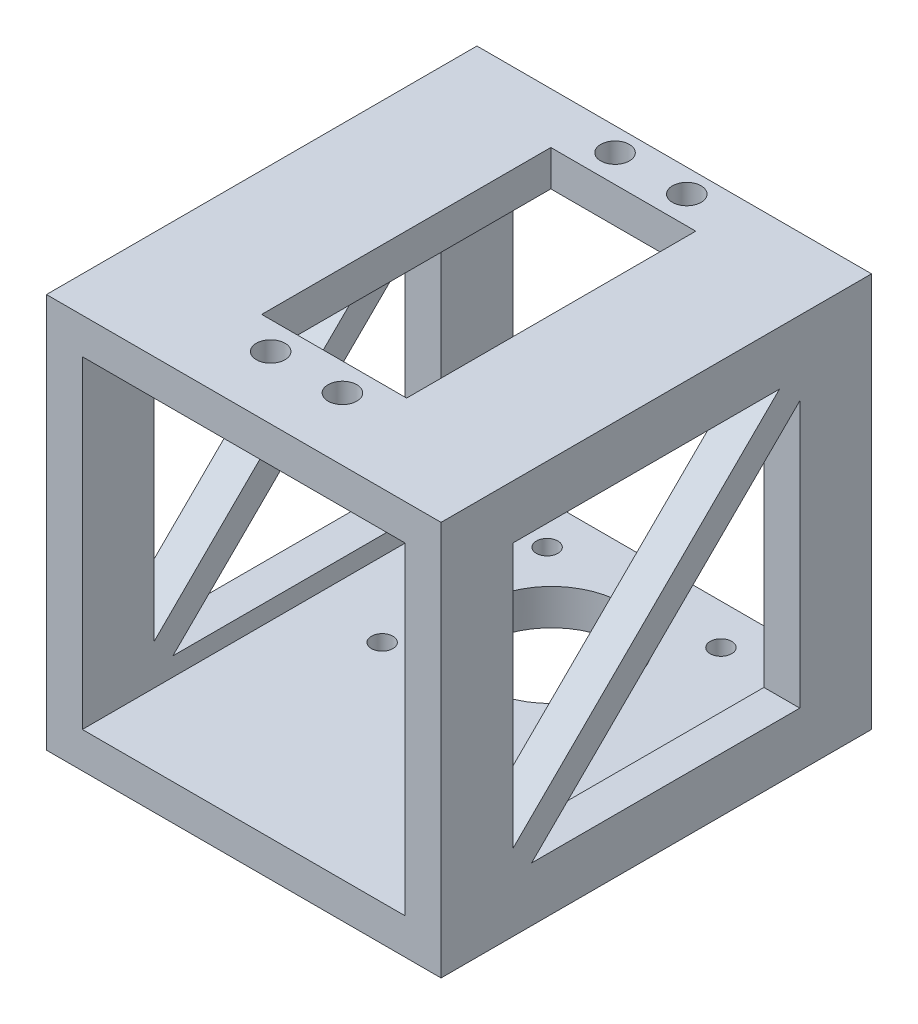
ISO-10303-21;
HEADER;
FILE_DESCRIPTION(('STEP AP214'),'2;1');
FILE_NAME('part.step','',(''),(''),'','','');
FILE_SCHEMA(('AUTOMOTIVE_DESIGN { 1 0 10303 214 1 1 1 1 }'));
ENDSEC;
DATA;
#1=APPLICATION_CONTEXT('core data for automotive mechanical design processes');
#2=APPLICATION_PROTOCOL_DEFINITION('international standard','automotive_design',2000,#1);
#3=PRODUCT_CONTEXT('',#1,'mechanical');
#4=PRODUCT('Part','Part','',(#3));
#5=PRODUCT_RELATED_PRODUCT_CATEGORY('part','',(#4));
#6=PRODUCT_DEFINITION_FORMATION('','',#4);
#7=PRODUCT_DEFINITION_CONTEXT('part definition',#1,'design');
#8=PRODUCT_DEFINITION('design','',#6,#7);
#9=PRODUCT_DEFINITION_SHAPE('','',#8);
#10=(LENGTH_UNIT() NAMED_UNIT(*) SI_UNIT(.MILLI.,.METRE.));
#11=(NAMED_UNIT(*) PLANE_ANGLE_UNIT() SI_UNIT($,.RADIAN.));
#12=(NAMED_UNIT(*) SI_UNIT($,.STERADIAN.) SOLID_ANGLE_UNIT());
#13=UNCERTAINTY_MEASURE_WITH_UNIT(LENGTH_MEASURE(1.E-05),#10,'distance_accuracy_value','');
#14=(GEOMETRIC_REPRESENTATION_CONTEXT(3) GLOBAL_UNCERTAINTY_ASSIGNED_CONTEXT((#13)) GLOBAL_UNIT_ASSIGNED_CONTEXT((#10,
#11,#12)) REPRESENTATION_CONTEXT('',''));
#15=CARTESIAN_POINT('',(0.,0.,0.));
#16=DIRECTION('',(0.,0.,1.));
#17=DIRECTION('',(1.,0.,0.));
#18=AXIS2_PLACEMENT_3D('',#15,#16,#17);
#19=CARTESIAN_POINT('',(0.,0.,60.));
#20=DIRECTION('',(0.,0.,1.));
#21=DIRECTION('',(1.,0.,0.));
#22=AXIS2_PLACEMENT_3D('',#19,#20,#21);
#23=PLANE('',#22);
#24=DIRECTION('',(0.,-1.,0.));
#25=VECTOR('',#24,1.);
#26=CARTESIAN_POINT('',(-46.5827180407304,34.5248020877095,60.));
#27=LINE('',#26,#25);
#28=CARTESIAN_POINT('',(-46.5827180407304,34.5248020877095,60.));
#29=VERTEX_POINT('',#28);
#30=CARTESIAN_POINT('',(-46.5827180407303,-20.4751979122905,60.));
#31=VERTEX_POINT('',#30);
#32=EDGE_CURVE('E416',#29,#31,#27,.T.);
#33=ORIENTED_EDGE('',*,*,#32,.T.);
#34=DIRECTION('',(1.,0.,0.));
#35=VECTOR('',#34,1.);
#36=CARTESIAN_POINT('',(-46.5827180407303,-20.4751979122905,60.));
#37=LINE('',#36,#35);
#38=CARTESIAN_POINT('',(8.41728195926964,-20.4751979122905,60.));
#39=VERTEX_POINT('',#38);
#40=EDGE_CURVE('E420',#31,#39,#37,.T.);
#41=ORIENTED_EDGE('',*,*,#40,.T.);
#42=DIRECTION('',(0.,1.,0.));
#43=VECTOR('',#42,1.);
#44=CARTESIAN_POINT('',(8.41728195926964,34.5248020877095,60.));
#45=LINE('',#44,#43);
#46=CARTESIAN_POINT('',(8.41728195926964,34.5248020877095,60.));
#47=VERTEX_POINT('',#46);
#48=EDGE_CURVE('E424',#39,#47,#45,.T.);
#49=ORIENTED_EDGE('',*,*,#48,.T.);
#50=DIRECTION('',(-1.,0.,0.));
#51=VECTOR('',#50,1.);
#52=CARTESIAN_POINT('',(-46.5827180407304,34.5248020877095,60.));
#53=LINE('',#52,#51);
#54=EDGE_CURVE('E427',#47,#29,#53,.T.);
#55=ORIENTED_EDGE('',*,*,#54,.T.);
#56=EDGE_LOOP('',(#33,#41,#49,#55));
#57=FACE_BOUND('',#56,.T.);
#58=DIRECTION('',(1.,0.,0.));
#59=VECTOR('',#58,1.);
#60=CARTESIAN_POINT('',(-41.5827180407303,-15.4751979122905,60.));
#61=LINE('',#60,#59);
#62=CARTESIAN_POINT('',(-41.5827180407303,-15.4751979122905,60.));
#63=VERTEX_POINT('',#62);
#64=CARTESIAN_POINT('',(3.41728195926965,-15.4751979122905,60.));
#65=VERTEX_POINT('',#64);
#66=EDGE_CURVE('E374',#63,#65,#61,.T.);
#67=ORIENTED_EDGE('',*,*,#66,.F.);
#68=DIRECTION('',(0.,-1.,0.));
#69=VECTOR('',#68,1.);
#70=CARTESIAN_POINT('',(-41.5827180407304,29.5248020877095,60.));
#71=LINE('',#70,#69);
#72=CARTESIAN_POINT('',(-41.5827180407304,29.5248020877095,60.));
#73=VERTEX_POINT('',#72);
#74=EDGE_CURVE('E371',#73,#63,#71,.T.);
#75=ORIENTED_EDGE('',*,*,#74,.F.);
#76=DIRECTION('',(-1.,0.,0.));
#77=VECTOR('',#76,1.);
#78=CARTESIAN_POINT('',(-41.5827180407304,29.5248020877095,60.));
#79=LINE('',#78,#77);
#80=CARTESIAN_POINT('',(3.41728195926964,29.5248020877095,60.));
#81=VERTEX_POINT('',#80);
#82=EDGE_CURVE('E382',#81,#73,#79,.T.);
#83=ORIENTED_EDGE('',*,*,#82,.F.);
#84=DIRECTION('',(0.,1.,0.));
#85=VECTOR('',#84,1.);
#86=CARTESIAN_POINT('',(3.41728195926964,29.5248020877095,60.));
#87=LINE('',#86,#85);
#88=EDGE_CURVE('E378',#65,#81,#87,.T.);
#89=ORIENTED_EDGE('',*,*,#88,.F.);
#90=EDGE_LOOP('',(#67,#75,#83,#89));
#91=FACE_BOUND('',#90,.T.);
#92=ADVANCED_FACE('F43',(#57,#91),#23,.T.);
#93=CARTESIAN_POINT('',(0.,0.,0.));
#94=DIRECTION('',(0.,0.,1.));
#95=DIRECTION('',(1.,0.,0.));
#96=AXIS2_PLACEMENT_3D('',#93,#94,#95);
#97=PLANE('',#96);
#98=DIRECTION('',(0.,-1.,0.));
#99=VECTOR('',#98,1.);
#100=CARTESIAN_POINT('',(-46.5827180407304,34.5248020877095,0.));
#101=LINE('',#100,#99);
#102=CARTESIAN_POINT('',(-46.5827180407304,34.5248020877095,0.));
#103=VERTEX_POINT('',#102);
#104=CARTESIAN_POINT('',(-46.5827180407303,-20.4751979122905,0.));
#105=VERTEX_POINT('',#104);
#106=EDGE_CURVE('E415',#103,#105,#101,.T.);
#107=ORIENTED_EDGE('',*,*,#106,.F.);
#108=DIRECTION('',(-1.,0.,0.));
#109=VECTOR('',#108,1.);
#110=CARTESIAN_POINT('',(-46.5827180407304,34.5248020877095,0.));
#111=LINE('',#110,#109);
#112=CARTESIAN_POINT('',(8.41728195926964,34.5248020877095,0.));
#113=VERTEX_POINT('',#112);
#114=EDGE_CURVE('E421',#113,#103,#111,.T.);
#115=ORIENTED_EDGE('',*,*,#114,.F.);
#116=DIRECTION('',(0.,1.,0.));
#117=VECTOR('',#116,1.);
#118=CARTESIAN_POINT('',(8.41728195926964,34.5248020877095,0.));
#119=LINE('',#118,#117);
#120=CARTESIAN_POINT('',(8.41728195926964,-20.4751979122905,0.));
#121=VERTEX_POINT('',#120);
#122=EDGE_CURVE('E437',#121,#113,#119,.T.);
#123=ORIENTED_EDGE('',*,*,#122,.F.);
#124=DIRECTION('',(1.,0.,0.));
#125=VECTOR('',#124,1.);
#126=CARTESIAN_POINT('',(-46.5827180407303,-20.4751979122905,0.));
#127=LINE('',#126,#125);
#128=EDGE_CURVE('E434',#105,#121,#127,.T.);
#129=ORIENTED_EDGE('',*,*,#128,.F.);
#130=EDGE_LOOP('',(#107,#115,#123,#129));
#131=FACE_BOUND('',#130,.T.);
#132=DIRECTION('',(0.,-1.,0.));
#133=VECTOR('',#132,1.);
#134=CARTESIAN_POINT('',(-41.5827180407304,29.5248020877095,0.));
#135=LINE('',#134,#133);
#136=CARTESIAN_POINT('',(-41.5827180407304,29.5248020877095,0.));
#137=VERTEX_POINT('',#136);
#138=CARTESIAN_POINT('',(-41.5827180407303,-15.4751979122905,0.));
#139=VERTEX_POINT('',#138);
#140=EDGE_CURVE('E386',#137,#139,#135,.T.);
#141=ORIENTED_EDGE('',*,*,#140,.T.);
#142=DIRECTION('',(1.,0.,0.));
#143=VECTOR('',#142,1.);
#144=CARTESIAN_POINT('',(-41.5827180407303,-15.4751979122905,0.));
#145=LINE('',#144,#143);
#146=CARTESIAN_POINT('',(3.41728195926965,-15.4751979122905,0.));
#147=VERTEX_POINT('',#146);
#148=EDGE_CURVE('E390',#139,#147,#145,.T.);
#149=ORIENTED_EDGE('',*,*,#148,.T.);
#150=DIRECTION('',(0.,1.,0.));
#151=VECTOR('',#150,1.);
#152=CARTESIAN_POINT('',(3.41728195926964,29.5248020877095,0.));
#153=LINE('',#152,#151);
#154=CARTESIAN_POINT('',(3.41728195926964,29.5248020877095,0.));
#155=VERTEX_POINT('',#154);
#156=EDGE_CURVE('E395',#147,#155,#153,.T.);
#157=ORIENTED_EDGE('',*,*,#156,.T.);
#158=DIRECTION('',(-1.,0.,0.));
#159=VECTOR('',#158,1.);
#160=CARTESIAN_POINT('',(-41.5827180407304,29.5248020877095,0.));
#161=LINE('',#160,#159);
#162=EDGE_CURVE('E375',#155,#137,#161,.T.);
#163=ORIENTED_EDGE('',*,*,#162,.T.);
#164=EDGE_LOOP('',(#141,#149,#157,#163));
#165=FACE_BOUND('',#164,.T.);
#166=ADVANCED_FACE('F745',(#131,#165),#97,.F.);
#167=CARTESIAN_POINT('',(-46.5827180407304,34.5248020877095,60.));
#168=DIRECTION('',(1.,0.,0.));
#169=DIRECTION('',(0.,1.,0.));
#170=AXIS2_PLACEMENT_3D('',#167,#168,#169);
#171=PLANE('',#170);
#172=DIRECTION('',(0.,0.,-1.));
#173=VECTOR('',#172,1.);
#174=CARTESIAN_POINT('',(-46.5827180407304,-12.8989881679018,47.3838632074241));
#175=LINE('',#174,#173);
#176=CARTESIAN_POINT('',(-46.5827180407303,-12.8989881679018,47.3838632074241));
#177=VERTEX_POINT('',#176);
#178=CARTESIAN_POINT('',(-46.5827180407304,-12.8989881679018,9.99999999999999));
#179=VERTEX_POINT('',#178);
#180=EDGE_CURVE('E59',#177,#179,#175,.T.);
#181=ORIENTED_EDGE('',*,*,#180,.T.);
#182=DIRECTION('',(0.,1.,0.));
#183=VECTOR('',#182,1.);
#184=CARTESIAN_POINT('',(-46.5827180407304,24.1963749629633,9.99999999999999));
#185=LINE('',#184,#183);
#186=CARTESIAN_POINT('',(-46.5827180407304,24.1963749629633,9.99999999999999));
#187=VERTEX_POINT('',#186);
#188=EDGE_CURVE('E211',#179,#187,#185,.T.);
#189=ORIENTED_EDGE('',*,*,#188,.T.);
#190=DIRECTION('',(0.,-0.704362473277771,0.709840479430429));
#191=VECTOR('',#190,1.);
#192=CARTESIAN_POINT('',(-46.5827180407304,-12.8989881679018,47.3838632074241));
#193=LINE('',#192,#191);
#194=EDGE_CURVE('E221',#187,#177,#193,.T.);
#195=ORIENTED_EDGE('',*,*,#194,.T.);
#196=EDGE_LOOP('',(#181,#189,#195));
#197=FACE_BOUND('',#196,.T.);
#198=DIRECTION('',(0.,0.,1.));
#199=VECTOR('',#198,1.);
#200=CARTESIAN_POINT('',(-46.5827180407304,27.0248020877095,50.));
#201=LINE('',#200,#199);
#202=CARTESIAN_POINT('',(-46.5827180407304,27.0248020877095,12.8284271247462));
#203=VERTEX_POINT('',#202);
#204=CARTESIAN_POINT('',(-46.5827180407304,27.0248020877095,50.));
#205=VERTEX_POINT('',#204);
#206=EDGE_CURVE('E67',#203,#205,#201,.T.);
#207=ORIENTED_EDGE('',*,*,#206,.T.);
#208=DIRECTION('',(0.,-1.,0.));
#209=VECTOR('',#208,1.);
#210=CARTESIAN_POINT('',(-46.5827180407304,27.0248020877095,50.));
#211=LINE('',#210,#209);
#212=CARTESIAN_POINT('',(-46.5827180407304,-9.85990900547463,50.));
#213=VERTEX_POINT('',#212);
#214=EDGE_CURVE('E253',#205,#213,#211,.T.);
#215=ORIENTED_EDGE('',*,*,#214,.T.);
#216=DIRECTION('',(0.,0.704362473277771,-0.709840479430429));
#217=VECTOR('',#216,1.);
#218=CARTESIAN_POINT('',(-46.5827180407304,-9.85990900547463,50.));
#219=LINE('',#218,#217);
#220=EDGE_CURVE('E257',#213,#203,#219,.T.);
#221=ORIENTED_EDGE('',*,*,#220,.T.);
#222=EDGE_LOOP('',(#207,#215,#221));
#223=FACE_BOUND('',#222,.T.);
#224=ORIENTED_EDGE('',*,*,#106,.T.);
#225=DIRECTION('',(0.,0.,-1.));
#226=VECTOR('',#225,1.);
#227=CARTESIAN_POINT('',(-46.5827180407303,-20.4751979122905,60.));
#228=LINE('',#227,#226);
#229=EDGE_CURVE('E453',#31,#105,#228,.T.);
#230=ORIENTED_EDGE('',*,*,#229,.F.);
#231=ORIENTED_EDGE('',*,*,#32,.F.);
#232=DIRECTION('',(0.,0.,-1.));
#233=VECTOR('',#232,1.);
#234=CARTESIAN_POINT('',(-46.5827180407304,34.5248020877095,60.));
#235=LINE('',#234,#233);
#236=EDGE_CURVE('E430',#29,#103,#235,.T.);
#237=ORIENTED_EDGE('',*,*,#236,.T.);
#238=EDGE_LOOP('',(#224,#230,#231,#237));
#239=FACE_BOUND('',#238,.T.);
#240=ADVANCED_FACE('F45',(#197,#223,#239),#171,.F.);
#241=CARTESIAN_POINT('',(-46.5827180407303,-20.4751979122905,60.));
#242=DIRECTION('',(0.,1.,0.));
#243=DIRECTION('',(0.,0.,1.));
#244=AXIS2_PLACEMENT_3D('',#241,#242,#243);
#245=PLANE('',#244);
#246=CARTESIAN_POINT('',(-6.96839153888422,-20.4751979122905,28.5949159808442));
#247=DIRECTION('',(0.,-1.,0.));
#248=DIRECTION('',(0.,0.,-1.));
#249=AXIS2_PLACEMENT_3D('',#246,#247,#248);
#250=CIRCLE('',#249,1.5);
#251=CARTESIAN_POINT('',(-6.96839153888422,-20.4751979122905,27.0949159808442));
#252=VERTEX_POINT('',#251);
#253=EDGE_CURVE('E304',#252,#252,#250,.T.);
#254=ORIENTED_EDGE('',*,*,#253,.F.);
#255=EDGE_LOOP('',(#254));
#256=FACE_BOUND('',#255,.T.);
#257=CARTESIAN_POINT('',(-31.1970445425765,-20.4751979122905,28.5949159808442));
#258=DIRECTION('',(0.,-1.,0.));
#259=DIRECTION('',(0.,0.,-1.));
#260=AXIS2_PLACEMENT_3D('',#257,#258,#259);
#261=CIRCLE('',#260,1.5);
#262=CARTESIAN_POINT('',(-31.1970445425765,-20.4751979122905,27.0949159808442));
#263=VERTEX_POINT('',#262);
#264=EDGE_CURVE('E314',#263,#263,#261,.T.);
#265=ORIENTED_EDGE('',*,*,#264,.F.);
#266=EDGE_LOOP('',(#265));
#267=FACE_BOUND('',#266,.T.);
#268=CARTESIAN_POINT('',(-6.96839153888422,-20.4751979122905,5.60508401915576));
#269=DIRECTION('',(0.,-1.,0.));
#270=DIRECTION('',(0.,0.,-1.));
#271=AXIS2_PLACEMENT_3D('',#268,#269,#270);
#272=CIRCLE('',#271,1.5);
#273=CARTESIAN_POINT('',(-6.96839153888422,-20.4751979122905,4.10508401915576));
#274=VERTEX_POINT('',#273);
#275=EDGE_CURVE('E310',#274,#274,#272,.T.);
#276=ORIENTED_EDGE('',*,*,#275,.F.);
#277=EDGE_LOOP('',(#276));
#278=FACE_BOUND('',#277,.T.);
#279=CARTESIAN_POINT('',(-31.1970445425765,-20.4751979122905,5.60508401915576));
#280=DIRECTION('',(0.,-1.,0.));
#281=DIRECTION('',(0.,0.,-1.));
#282=AXIS2_PLACEMENT_3D('',#279,#280,#281);
#283=CIRCLE('',#282,1.5);
#284=CARTESIAN_POINT('',(-31.1970445425765,-20.4751979122905,4.10508401915576));
#285=VERTEX_POINT('',#284);
#286=EDGE_CURVE('E305',#285,#285,#283,.T.);
#287=ORIENTED_EDGE('',*,*,#286,.F.);
#288=EDGE_LOOP('',(#287));
#289=FACE_BOUND('',#288,.T.);
#290=CARTESIAN_POINT('',(-19.0827180407304,-20.4751979122905,17.1));
#291=DIRECTION('',(0.,-1.,0.));
#292=DIRECTION('',(0.,0.,-1.));
#293=AXIS2_PLACEMENT_3D('',#290,#291,#292);
#294=CIRCLE('',#293,10.);
#295=CARTESIAN_POINT('',(-19.0827180407304,-20.4751979122905,7.1));
#296=VERTEX_POINT('',#295);
#297=EDGE_CURVE('E309',#296,#296,#294,.T.);
#298=ORIENTED_EDGE('',*,*,#297,.F.);
#299=EDGE_LOOP('',(#298));
#300=FACE_BOUND('',#299,.T.);
#301=ORIENTED_EDGE('',*,*,#128,.T.);
#302=DIRECTION('',(0.,0.,-1.));
#303=VECTOR('',#302,1.);
#304=CARTESIAN_POINT('',(8.41728195926964,-20.4751979122905,60.));
#305=LINE('',#304,#303);
#306=EDGE_CURVE('E449',#39,#121,#305,.T.);
#307=ORIENTED_EDGE('',*,*,#306,.F.);
#308=ORIENTED_EDGE('',*,*,#40,.F.);
#309=ORIENTED_EDGE('',*,*,#229,.T.);
#310=EDGE_LOOP('',(#301,#307,#308,#309));
#311=FACE_BOUND('',#310,.T.);
#312=ADVANCED_FACE('F784',(#256,#267,#278,#289,#300,#311),#245,.F.);
#313=CARTESIAN_POINT('',(8.41728195926964,34.5248020877095,60.));
#314=DIRECTION('',(-1.,0.,0.));
#315=DIRECTION('',(0.,0.,1.));
#316=AXIS2_PLACEMENT_3D('',#313,#314,#315);
#317=PLANE('',#316);
#318=DIRECTION('',(0.,-0.704362473277771,0.709840479430429));
#319=VECTOR('',#318,1.);
#320=CARTESIAN_POINT('',(8.41728195926964,-12.8989881679018,47.3838632074241));
#321=LINE('',#320,#319);
#322=CARTESIAN_POINT('',(8.41728195926964,24.1963749629633,9.99999999999999));
#323=VERTEX_POINT('',#322);
#324=CARTESIAN_POINT('',(8.41728195926964,-12.8989881679018,47.3838632074241));
#325=VERTEX_POINT('',#324);
#326=EDGE_CURVE('E235',#323,#325,#321,.T.);
#327=ORIENTED_EDGE('',*,*,#326,.F.);
#328=DIRECTION('',(0.,1.,0.));
#329=VECTOR('',#328,1.);
#330=CARTESIAN_POINT('',(8.41728195926964,24.1963749629633,9.99999999999999));
#331=LINE('',#330,#329);
#332=CARTESIAN_POINT('',(8.41728195926964,-12.8989881679018,9.99999999999999));
#333=VERTEX_POINT('',#332);
#334=EDGE_CURVE('E240',#333,#323,#331,.T.);
#335=ORIENTED_EDGE('',*,*,#334,.F.);
#336=DIRECTION('',(0.,0.,-1.));
#337=VECTOR('',#336,1.);
#338=CARTESIAN_POINT('',(8.41728195926964,-12.8989881679018,47.3838632074241));
#339=LINE('',#338,#337);
#340=EDGE_CURVE('E229',#325,#333,#339,.T.);
#341=ORIENTED_EDGE('',*,*,#340,.F.);
#342=EDGE_LOOP('',(#327,#335,#341));
#343=FACE_BOUND('',#342,.T.);
#344=DIRECTION('',(0.,0.704362473277771,-0.709840479430429));
#345=VECTOR('',#344,1.);
#346=CARTESIAN_POINT('',(8.41728195926964,-9.85990900547463,50.));
#347=LINE('',#346,#345);
#348=CARTESIAN_POINT('',(8.41728195926964,-9.85990900547463,50.));
#349=VERTEX_POINT('',#348);
#350=CARTESIAN_POINT('',(8.41728195926964,27.0248020877095,12.8284271247462));
#351=VERTEX_POINT('',#350);
#352=EDGE_CURVE('E267',#349,#351,#347,.T.);
#353=ORIENTED_EDGE('',*,*,#352,.F.);
#354=DIRECTION('',(0.,-1.,0.));
#355=VECTOR('',#354,1.);
#356=CARTESIAN_POINT('',(8.41728195926964,27.0248020877095,50.));
#357=LINE('',#356,#355);
#358=CARTESIAN_POINT('',(8.41728195926964,27.0248020877095,50.));
#359=VERTEX_POINT('',#358);
#360=EDGE_CURVE('E249',#359,#349,#357,.T.);
#361=ORIENTED_EDGE('',*,*,#360,.F.);
#362=DIRECTION('',(0.,0.,1.));
#363=VECTOR('',#362,1.);
#364=CARTESIAN_POINT('',(8.41728195926964,27.0248020877095,50.));
#365=LINE('',#364,#363);
#366=EDGE_CURVE('E258',#351,#359,#365,.T.);
#367=ORIENTED_EDGE('',*,*,#366,.F.);
#368=EDGE_LOOP('',(#353,#361,#367));
#369=FACE_BOUND('',#368,.T.);
#370=ORIENTED_EDGE('',*,*,#122,.T.);
#371=DIRECTION('',(0.,0.,-1.));
#372=VECTOR('',#371,1.);
#373=CARTESIAN_POINT('',(8.41728195926964,34.5248020877095,60.));
#374=LINE('',#373,#372);
#375=EDGE_CURVE('E445',#47,#113,#374,.T.);
#376=ORIENTED_EDGE('',*,*,#375,.F.);
#377=ORIENTED_EDGE('',*,*,#48,.F.);
#378=ORIENTED_EDGE('',*,*,#306,.T.);
#379=EDGE_LOOP('',(#370,#376,#377,#378));
#380=FACE_BOUND('',#379,.T.);
#381=ADVANCED_FACE('F730',(#343,#369,#380),#317,.F.);
#382=CARTESIAN_POINT('',(-46.5827180407304,34.5248020877095,60.));
#383=DIRECTION('',(0.,-1.,0.));
#384=DIRECTION('',(0.,0.,-1.));
#385=AXIS2_PLACEMENT_3D('',#382,#383,#384);
#386=PLANE('',#385);
#387=CARTESIAN_POINT('',(-14.0827180407304,34.5248020877095,51.25));
#388=DIRECTION('',(0.,1.,0.));
#389=DIRECTION('',(0.,0.,1.));
#390=AXIS2_PLACEMENT_3D('',#387,#388,#389);
#391=CIRCLE('',#390,2.);
#392=CARTESIAN_POINT('',(-14.0827180407304,34.5248020877095,53.25));
#393=VERTEX_POINT('',#392);
#394=EDGE_CURVE('E338',#393,#393,#391,.T.);
#395=ORIENTED_EDGE('',*,*,#394,.F.);
#396=EDGE_LOOP('',(#395));
#397=FACE_BOUND('',#396,.T.);
#398=CARTESIAN_POINT('',(-24.0827180407304,34.5248020877095,51.25));
#399=DIRECTION('',(0.,1.,0.));
#400=DIRECTION('',(0.,0.,1.));
#401=AXIS2_PLACEMENT_3D('',#398,#399,#400);
#402=CIRCLE('',#401,2.);
#403=CARTESIAN_POINT('',(-24.0827180407304,34.5248020877095,53.25));
#404=VERTEX_POINT('',#403);
#405=EDGE_CURVE('E334',#404,#404,#402,.T.);
#406=ORIENTED_EDGE('',*,*,#405,.F.);
#407=EDGE_LOOP('',(#406));
#408=FACE_BOUND('',#407,.T.);
#409=CARTESIAN_POINT('',(-14.0827180407304,34.5248020877095,3.25));
#410=DIRECTION('',(0.,1.,0.));
#411=DIRECTION('',(0.,0.,1.));
#412=AXIS2_PLACEMENT_3D('',#409,#410,#411);
#413=CIRCLE('',#412,2.);
#414=CARTESIAN_POINT('',(-14.0827180407304,34.5248020877095,5.25));
#415=VERTEX_POINT('',#414);
#416=EDGE_CURVE('E330',#415,#415,#413,.T.);
#417=ORIENTED_EDGE('',*,*,#416,.F.);
#418=EDGE_LOOP('',(#417));
#419=FACE_BOUND('',#418,.T.);
#420=CARTESIAN_POINT('',(-24.0827180407304,34.5248020877095,3.25));
#421=DIRECTION('',(0.,1.,0.));
#422=DIRECTION('',(0.,0.,1.));
#423=AXIS2_PLACEMENT_3D('',#420,#421,#422);
#424=CIRCLE('',#423,2.);
#425=CARTESIAN_POINT('',(-24.0827180407304,34.5248020877095,5.25000000000001));
#426=VERTEX_POINT('',#425);
#427=EDGE_CURVE('E325',#426,#426,#424,.T.);
#428=ORIENTED_EDGE('',*,*,#427,.F.);
#429=EDGE_LOOP('',(#428));
#430=FACE_BOUND('',#429,.T.);
#431=DIRECTION('',(1.,0.,0.));
#432=VECTOR('',#431,1.);
#433=CARTESIAN_POINT('',(-29.1827180407304,34.5248020877095,47.4));
#434=LINE('',#433,#432);
#435=CARTESIAN_POINT('',(-29.1827180407304,34.5248020877095,47.4));
#436=VERTEX_POINT('',#435);
#437=CARTESIAN_POINT('',(-8.98271804073036,34.5248020877095,47.4));
#438=VERTEX_POINT('',#437);
#439=EDGE_CURVE('E345',#436,#438,#434,.T.);
#440=ORIENTED_EDGE('',*,*,#439,.F.);
#441=DIRECTION('',(0.,0.,1.));
#442=VECTOR('',#441,1.);
#443=CARTESIAN_POINT('',(-29.1827180407304,34.5248020877095,7.1));
#444=LINE('',#443,#442);
#445=CARTESIAN_POINT('',(-29.1827180407304,34.5248020877095,7.1));
#446=VERTEX_POINT('',#445);
#447=EDGE_CURVE('E329',#446,#436,#444,.T.);
#448=ORIENTED_EDGE('',*,*,#447,.F.);
#449=DIRECTION('',(-1.,0.,0.));
#450=VECTOR('',#449,1.);
#451=CARTESIAN_POINT('',(-29.1827180407304,34.5248020877095,7.1));
#452=LINE('',#451,#450);
#453=CARTESIAN_POINT('',(-8.98271804073037,34.5248020877095,7.1));
#454=VERTEX_POINT('',#453);
#455=EDGE_CURVE('E353',#454,#446,#452,.T.);
#456=ORIENTED_EDGE('',*,*,#455,.F.);
#457=DIRECTION('',(0.,0.,-1.));
#458=VECTOR('',#457,1.);
#459=CARTESIAN_POINT('',(-8.98271804073037,34.5248020877095,7.1));
#460=LINE('',#459,#458);
#461=EDGE_CURVE('E349',#438,#454,#460,.T.);
#462=ORIENTED_EDGE('',*,*,#461,.F.);
#463=EDGE_LOOP('',(#440,#448,#456,#462));
#464=FACE_BOUND('',#463,.T.);
#465=ORIENTED_EDGE('',*,*,#114,.T.);
#466=ORIENTED_EDGE('',*,*,#236,.F.);
#467=ORIENTED_EDGE('',*,*,#54,.F.);
#468=ORIENTED_EDGE('',*,*,#375,.T.);
#469=EDGE_LOOP('',(#465,#466,#467,#468));
#470=FACE_BOUND('',#469,.T.);
#471=ADVANCED_FACE('F779',(#397,#408,#419,#430,#464,#470),#386,.F.);
#472=CARTESIAN_POINT('',(-41.5827180407304,29.5248020877095,60.));
#473=DIRECTION('',(1.,0.,0.));
#474=DIRECTION('',(0.,1.,0.));
#475=AXIS2_PLACEMENT_3D('',#472,#473,#474);
#476=PLANE('',#475);
#477=DIRECTION('',(0.,1.,0.));
#478=VECTOR('',#477,1.);
#479=CARTESIAN_POINT('',(-41.5827180407304,29.5248020877095,9.99999999999999));
#480=LINE('',#479,#478);
#481=CARTESIAN_POINT('',(-41.5827180407303,-12.8989881679018,9.99999999999999));
#482=VERTEX_POINT('',#481);
#483=CARTESIAN_POINT('',(-41.5827180407303,24.1963749629633,9.99999999999999));
#484=VERTEX_POINT('',#483);
#485=EDGE_CURVE('E213',#482,#484,#480,.T.);
#486=ORIENTED_EDGE('',*,*,#485,.F.);
#487=DIRECTION('',(0.,0.,-1.));
#488=VECTOR('',#487,1.);
#489=CARTESIAN_POINT('',(-41.5827180407303,-12.8989881679018,60.));
#490=LINE('',#489,#488);
#491=CARTESIAN_POINT('',(-41.5827180407303,-12.8989881679018,47.3838632074241));
#492=VERTEX_POINT('',#491);
#493=EDGE_CURVE('E299',#492,#482,#490,.T.);
#494=ORIENTED_EDGE('',*,*,#493,.F.);
#495=DIRECTION('',(0.,-0.704362473277771,0.709840479430429));
#496=VECTOR('',#495,1.);
#497=CARTESIAN_POINT('',(-41.5827180407303,1.84069904341504,32.5295416987176));
#498=LINE('',#497,#496);
#499=EDGE_CURVE('E296',#484,#492,#498,.T.);
#500=ORIENTED_EDGE('',*,*,#499,.F.);
#501=EDGE_LOOP('',(#486,#494,#500));
#502=FACE_BOUND('',#501,.T.);
#503=DIRECTION('',(0.,-1.,0.));
#504=VECTOR('',#503,1.);
#505=CARTESIAN_POINT('',(-41.5827180407304,29.5248020877095,50.));
#506=LINE('',#505,#504);
#507=CARTESIAN_POINT('',(-41.5827180407304,27.0248020877095,50.));
#508=VERTEX_POINT('',#507);
#509=CARTESIAN_POINT('',(-41.5827180407303,-9.85990900547463,50.));
#510=VERTEX_POINT('',#509);
#511=EDGE_CURVE('E292',#508,#510,#506,.T.);
#512=ORIENTED_EDGE('',*,*,#511,.F.);
#513=DIRECTION('',(0.,0.,1.));
#514=VECTOR('',#513,1.);
#515=CARTESIAN_POINT('',(-41.5827180407304,27.0248020877095,60.));
#516=LINE('',#515,#514);
#517=CARTESIAN_POINT('',(-41.5827180407303,27.0248020877095,12.8284271247462));
#518=VERTEX_POINT('',#517);
#519=EDGE_CURVE('E289',#518,#508,#516,.T.);
#520=ORIENTED_EDGE('',*,*,#519,.F.);
#521=DIRECTION('',(0.,0.704362473277771,-0.709840479430429));
#522=VECTOR('',#521,1.);
#523=CARTESIAN_POINT('',(-41.5827180407303,4.68003965977233,35.3469704548519));
#524=LINE('',#523,#522);
#525=EDGE_CURVE('E278',#510,#518,#524,.T.);
#526=ORIENTED_EDGE('',*,*,#525,.F.);
#527=EDGE_LOOP('',(#512,#520,#526));
#528=FACE_BOUND('',#527,.T.);
#529=ORIENTED_EDGE('',*,*,#140,.F.);
#530=DIRECTION('',(0.,0.,-1.));
#531=VECTOR('',#530,1.);
#532=CARTESIAN_POINT('',(-41.5827180407304,29.5248020877095,60.));
#533=LINE('',#532,#531);
#534=EDGE_CURVE('E385',#73,#137,#533,.T.);
#535=ORIENTED_EDGE('',*,*,#534,.F.);
#536=ORIENTED_EDGE('',*,*,#74,.T.);
#537=DIRECTION('',(0.,0.,-1.));
#538=VECTOR('',#537,1.);
#539=CARTESIAN_POINT('',(-41.5827180407303,-15.4751979122905,60.));
#540=LINE('',#539,#538);
#541=EDGE_CURVE('E411',#63,#139,#540,.T.);
#542=ORIENTED_EDGE('',*,*,#541,.T.);
#543=EDGE_LOOP('',(#529,#535,#536,#542));
#544=FACE_BOUND('',#543,.T.);
#545=ADVANCED_FACE('F750',(#502,#528,#544),#476,.T.);
#546=CARTESIAN_POINT('',(-41.5827180407303,-15.4751979122905,60.));
#547=DIRECTION('',(0.,1.,0.));
#548=DIRECTION('',(-1.,0.,0.));
#549=AXIS2_PLACEMENT_3D('',#546,#547,#548);
#550=PLANE('',#549);
#551=CARTESIAN_POINT('',(-6.96839153888422,-15.4751979122905,28.5949159808442));
#552=DIRECTION('',(0.,1.,0.));
#553=DIRECTION('',(-1.,0.,0.));
#554=AXIS2_PLACEMENT_3D('',#551,#552,#553);
#555=CIRCLE('',#554,1.5);
#556=CARTESIAN_POINT('',(-8.46839153888422,-15.4751979122905,28.5949159808442));
#557=VERTEX_POINT('',#556);
#558=EDGE_CURVE('E342',#557,#557,#555,.T.);
#559=ORIENTED_EDGE('',*,*,#558,.F.);
#560=EDGE_LOOP('',(#559));
#561=FACE_BOUND('',#560,.T.);
#562=CARTESIAN_POINT('',(-31.1970445425765,-15.4751979122905,28.5949159808442));
#563=DIRECTION('',(0.,1.,0.));
#564=DIRECTION('',(-1.,0.,0.));
#565=AXIS2_PLACEMENT_3D('',#562,#563,#564);
#566=CIRCLE('',#565,1.5);
#567=CARTESIAN_POINT('',(-32.6970445425765,-15.4751979122905,28.5949159808442));
#568=VERTEX_POINT('',#567);
#569=EDGE_CURVE('E496',#568,#568,#566,.T.);
#570=ORIENTED_EDGE('',*,*,#569,.F.);
#571=EDGE_LOOP('',(#570));
#572=FACE_BOUND('',#571,.T.);
#573=CARTESIAN_POINT('',(-6.96839153888422,-15.4751979122905,5.60508401915576));
#574=DIRECTION('',(0.,1.,0.));
#575=DIRECTION('',(-1.,0.,0.));
#576=AXIS2_PLACEMENT_3D('',#573,#574,#575);
#577=CIRCLE('',#576,1.5);
#578=CARTESIAN_POINT('',(-8.46839153888422,-15.4751979122905,5.60508401915576));
#579=VERTEX_POINT('',#578);
#580=EDGE_CURVE('E492',#579,#579,#577,.T.);
#581=ORIENTED_EDGE('',*,*,#580,.F.);
#582=EDGE_LOOP('',(#581));
#583=FACE_BOUND('',#582,.T.);
#584=CARTESIAN_POINT('',(-31.1970445425765,-15.4751979122905,5.60508401915576));
#585=DIRECTION('',(0.,1.,0.));
#586=DIRECTION('',(-1.,0.,0.));
#587=AXIS2_PLACEMENT_3D('',#584,#585,#586);
#588=CIRCLE('',#587,1.5);
#589=CARTESIAN_POINT('',(-32.6970445425765,-15.4751979122905,5.60508401915576));
#590=VERTEX_POINT('',#589);
#591=EDGE_CURVE('E488',#590,#590,#588,.T.);
#592=ORIENTED_EDGE('',*,*,#591,.F.);
#593=EDGE_LOOP('',(#592));
#594=FACE_BOUND('',#593,.T.);
#595=CARTESIAN_POINT('',(-19.0827180407304,-15.4751979122905,17.1));
#596=DIRECTION('',(0.,1.,0.));
#597=DIRECTION('',(-1.,0.,0.));
#598=AXIS2_PLACEMENT_3D('',#595,#596,#597);
#599=CIRCLE('',#598,10.);
#600=CARTESIAN_POINT('',(-29.0827180407304,-15.4751979122905,17.1));
#601=VERTEX_POINT('',#600);
#602=EDGE_CURVE('E324',#601,#601,#599,.T.);
#603=ORIENTED_EDGE('',*,*,#602,.F.);
#604=EDGE_LOOP('',(#603));
#605=FACE_BOUND('',#604,.T.);
#606=ORIENTED_EDGE('',*,*,#148,.F.);
#607=ORIENTED_EDGE('',*,*,#541,.F.);
#608=ORIENTED_EDGE('',*,*,#66,.T.);
#609=DIRECTION('',(0.,0.,-1.));
#610=VECTOR('',#609,1.);
#611=CARTESIAN_POINT('',(3.41728195926965,-15.4751979122905,60.));
#612=LINE('',#611,#610);
#613=EDGE_CURVE('E408',#65,#147,#612,.T.);
#614=ORIENTED_EDGE('',*,*,#613,.T.);
#615=EDGE_LOOP('',(#606,#607,#608,#614));
#616=FACE_BOUND('',#615,.T.);
#617=ADVANCED_FACE('F738',(#561,#572,#583,#594,#605,#616),#550,.T.);
#618=CARTESIAN_POINT('',(3.41728195926964,29.5248020877095,60.));
#619=DIRECTION('',(-1.,0.,0.));
#620=DIRECTION('',(0.,-1.,0.));
#621=AXIS2_PLACEMENT_3D('',#618,#619,#620);
#622=PLANE('',#621);
#623=DIRECTION('',(0.,-1.,0.));
#624=VECTOR('',#623,1.);
#625=CARTESIAN_POINT('',(3.41728195926964,29.5248020877095,9.99999999999999));
#626=LINE('',#625,#624);
#627=CARTESIAN_POINT('',(3.41728195926964,24.1963749629633,9.99999999999999));
#628=VERTEX_POINT('',#627);
#629=CARTESIAN_POINT('',(3.41728195926965,-12.8989881679018,9.99999999999999));
#630=VERTEX_POINT('',#629);
#631=EDGE_CURVE('E11',#628,#630,#626,.T.);
#632=ORIENTED_EDGE('',*,*,#631,.F.);
#633=DIRECTION('',(0.,0.704362473277771,-0.709840479430429));
#634=VECTOR('',#633,1.);
#635=CARTESIAN_POINT('',(3.41728195926965,1.84069904341504,32.5295416987176));
#636=LINE('',#635,#634);
#637=CARTESIAN_POINT('',(3.41728195926965,-12.8989881679018,47.3838632074241));
#638=VERTEX_POINT('',#637);
#639=EDGE_CURVE('E512',#638,#628,#636,.T.);
#640=ORIENTED_EDGE('',*,*,#639,.F.);
#641=DIRECTION('',(0.,0.,1.));
#642=VECTOR('',#641,1.);
#643=CARTESIAN_POINT('',(3.41728195926965,-12.8989881679018,60.));
#644=LINE('',#643,#642);
#645=EDGE_CURVE('E52',#630,#638,#644,.T.);
#646=ORIENTED_EDGE('',*,*,#645,.F.);
#647=EDGE_LOOP('',(#632,#640,#646));
#648=FACE_BOUND('',#647,.T.);
#649=DIRECTION('',(0.,1.,0.));
#650=VECTOR('',#649,1.);
#651=CARTESIAN_POINT('',(3.41728195926964,29.5248020877095,50.));
#652=LINE('',#651,#650);
#653=CARTESIAN_POINT('',(3.41728195926964,-9.85990900547463,50.));
#654=VERTEX_POINT('',#653);
#655=CARTESIAN_POINT('',(3.41728195926964,27.0248020877095,50.));
#656=VERTEX_POINT('',#655);
#657=EDGE_CURVE('E509',#654,#656,#652,.T.);
#658=ORIENTED_EDGE('',*,*,#657,.F.);
#659=DIRECTION('',(0.,-0.704362473277771,0.709840479430429));
#660=VECTOR('',#659,1.);
#661=CARTESIAN_POINT('',(3.41728195926965,4.68003965977233,35.3469704548519));
#662=LINE('',#661,#660);
#663=CARTESIAN_POINT('',(3.41728195926964,27.0248020877095,12.8284271247462));
#664=VERTEX_POINT('',#663);
#665=EDGE_CURVE('E470',#664,#654,#662,.T.);
#666=ORIENTED_EDGE('',*,*,#665,.F.);
#667=DIRECTION('',(0.,0.,-1.));
#668=VECTOR('',#667,1.);
#669=CARTESIAN_POINT('',(3.41728195926964,27.0248020877095,60.));
#670=LINE('',#669,#668);
#671=EDGE_CURVE('E505',#656,#664,#670,.T.);
#672=ORIENTED_EDGE('',*,*,#671,.F.);
#673=EDGE_LOOP('',(#658,#666,#672));
#674=FACE_BOUND('',#673,.T.);
#675=ORIENTED_EDGE('',*,*,#156,.F.);
#676=ORIENTED_EDGE('',*,*,#613,.F.);
#677=ORIENTED_EDGE('',*,*,#88,.T.);
#678=DIRECTION('',(0.,0.,-1.));
#679=VECTOR('',#678,1.);
#680=CARTESIAN_POINT('',(3.41728195926964,29.5248020877095,60.));
#681=LINE('',#680,#679);
#682=EDGE_CURVE('E405',#81,#155,#681,.T.);
#683=ORIENTED_EDGE('',*,*,#682,.T.);
#684=EDGE_LOOP('',(#675,#676,#677,#683));
#685=FACE_BOUND('',#684,.T.);
#686=ADVANCED_FACE('F525',(#648,#674,#685),#622,.T.);
#687=CARTESIAN_POINT('',(-41.5827180407304,29.5248020877095,60.));
#688=DIRECTION('',(0.,-1.,0.));
#689=DIRECTION('',(0.,0.,-1.));
#690=AXIS2_PLACEMENT_3D('',#687,#688,#689);
#691=PLANE('',#690);
#692=CARTESIAN_POINT('',(-14.0827180407304,29.5248020877095,51.25));
#693=DIRECTION('',(0.,-1.,0.));
#694=DIRECTION('',(0.,0.,-1.));
#695=AXIS2_PLACEMENT_3D('',#692,#693,#694);
#696=CIRCLE('',#695,2.);
#697=CARTESIAN_POINT('',(-14.0827180407304,29.5248020877095,49.25));
#698=VERTEX_POINT('',#697);
#699=EDGE_CURVE('E391',#698,#698,#696,.T.);
#700=ORIENTED_EDGE('',*,*,#699,.F.);
#701=EDGE_LOOP('',(#700));
#702=FACE_BOUND('',#701,.T.);
#703=CARTESIAN_POINT('',(-24.0827180407304,29.5248020877095,51.25));
#704=DIRECTION('',(0.,-1.,0.));
#705=DIRECTION('',(0.,0.,-1.));
#706=AXIS2_PLACEMENT_3D('',#703,#704,#705);
#707=CIRCLE('',#706,2.);
#708=CARTESIAN_POINT('',(-24.0827180407304,29.5248020877095,49.25));
#709=VERTEX_POINT('',#708);
#710=EDGE_CURVE('E478',#709,#709,#707,.T.);
#711=ORIENTED_EDGE('',*,*,#710,.F.);
#712=EDGE_LOOP('',(#711));
#713=FACE_BOUND('',#712,.T.);
#714=CARTESIAN_POINT('',(-14.0827180407304,29.5248020877095,3.25));
#715=DIRECTION('',(0.,-1.,0.));
#716=DIRECTION('',(0.,0.,-1.));
#717=AXIS2_PLACEMENT_3D('',#714,#715,#716);
#718=CIRCLE('',#717,2.);
#719=CARTESIAN_POINT('',(-14.0827180407304,29.5248020877095,1.25));
#720=VERTEX_POINT('',#719);
#721=EDGE_CURVE('E474',#720,#720,#718,.T.);
#722=ORIENTED_EDGE('',*,*,#721,.F.);
#723=EDGE_LOOP('',(#722));
#724=FACE_BOUND('',#723,.T.);
#725=CARTESIAN_POINT('',(-24.0827180407304,29.5248020877095,3.25));
#726=DIRECTION('',(0.,-1.,0.));
#727=DIRECTION('',(0.,0.,-1.));
#728=AXIS2_PLACEMENT_3D('',#725,#726,#727);
#729=CIRCLE('',#728,2.);
#730=CARTESIAN_POINT('',(-24.0827180407304,29.5248020877095,1.25));
#731=VERTEX_POINT('',#730);
#732=EDGE_CURVE('E361',#731,#731,#729,.T.);
#733=ORIENTED_EDGE('',*,*,#732,.F.);
#734=EDGE_LOOP('',(#733));
#735=FACE_BOUND('',#734,.T.);
#736=DIRECTION('',(0.,0.,-1.));
#737=VECTOR('',#736,1.);
#738=CARTESIAN_POINT('',(-29.1827180407304,29.5248020877095,60.));
#739=LINE('',#738,#737);
#740=CARTESIAN_POINT('',(-29.1827180407304,29.5248020877095,47.4));
#741=VERTEX_POINT('',#740);
#742=CARTESIAN_POINT('',(-29.1827180407304,29.5248020877095,7.1));
#743=VERTEX_POINT('',#742);
#744=EDGE_CURVE('E467',#741,#743,#739,.T.);
#745=ORIENTED_EDGE('',*,*,#744,.F.);
#746=DIRECTION('',(-1.,0.,0.));
#747=VECTOR('',#746,1.);
#748=CARTESIAN_POINT('',(-41.5827180407303,29.5248020877095,47.4));
#749=LINE('',#748,#747);
#750=CARTESIAN_POINT('',(-8.98271804073037,29.5248020877095,47.4));
#751=VERTEX_POINT('',#750);
#752=EDGE_CURVE('E457',#751,#741,#749,.T.);
#753=ORIENTED_EDGE('',*,*,#752,.F.);
#754=DIRECTION('',(0.,0.,1.));
#755=VECTOR('',#754,1.);
#756=CARTESIAN_POINT('',(-8.98271804073036,29.5248020877095,60.));
#757=LINE('',#756,#755);
#758=CARTESIAN_POINT('',(-8.98271804073037,29.5248020877095,7.1));
#759=VERTEX_POINT('',#758);
#760=EDGE_CURVE('E460',#759,#751,#757,.T.);
#761=ORIENTED_EDGE('',*,*,#760,.F.);
#762=DIRECTION('',(1.,0.,0.));
#763=VECTOR('',#762,1.);
#764=CARTESIAN_POINT('',(-41.5827180407304,29.5248020877095,7.1));
#765=LINE('',#764,#763);
#766=EDGE_CURVE('E464',#743,#759,#765,.T.);
#767=ORIENTED_EDGE('',*,*,#766,.F.);
#768=EDGE_LOOP('',(#745,#753,#761,#767));
#769=FACE_BOUND('',#768,.T.);
#770=ORIENTED_EDGE('',*,*,#162,.F.);
#771=ORIENTED_EDGE('',*,*,#682,.F.);
#772=ORIENTED_EDGE('',*,*,#82,.T.);
#773=ORIENTED_EDGE('',*,*,#534,.T.);
#774=EDGE_LOOP('',(#770,#771,#772,#773));
#775=FACE_BOUND('',#774,.T.);
#776=ADVANCED_FACE('F737',(#702,#713,#724,#735,#769,#775),#691,.T.);
#777=CARTESIAN_POINT('',(-29.1827180407304,24.5248020877095,7.1));
#778=DIRECTION('',(-1.,0.,0.));
#779=DIRECTION('',(0.,0.,1.));
#780=AXIS2_PLACEMENT_3D('',#777,#778,#779);
#781=PLANE('',#780);
#782=ORIENTED_EDGE('',*,*,#744,.T.);
#783=DIRECTION('',(0.,1.,0.));
#784=VECTOR('',#783,1.);
#785=CARTESIAN_POINT('',(-29.1827180407304,24.5248020877095,7.1));
#786=LINE('',#785,#784);
#787=EDGE_CURVE('E358',#743,#446,#786,.T.);
#788=ORIENTED_EDGE('',*,*,#787,.T.);
#789=ORIENTED_EDGE('',*,*,#447,.T.);
#790=DIRECTION('',(0.,1.,0.));
#791=VECTOR('',#790,1.);
#792=CARTESIAN_POINT('',(-29.1827180407304,24.5248020877095,47.4));
#793=LINE('',#792,#791);
#794=EDGE_CURVE('E357',#741,#436,#793,.T.);
#795=ORIENTED_EDGE('',*,*,#794,.F.);
#796=EDGE_LOOP('',(#782,#788,#789,#795));
#797=FACE_BOUND('',#796,.T.);
#798=ADVANCED_FACE('F757',(#797),#781,.F.);
#799=CARTESIAN_POINT('',(-29.1827180407304,24.5248020877095,7.1));
#800=DIRECTION('',(0.,0.,-1.));
#801=DIRECTION('',(-1.,0.,0.));
#802=AXIS2_PLACEMENT_3D('',#799,#800,#801);
#803=PLANE('',#802);
#804=ORIENTED_EDGE('',*,*,#766,.T.);
#805=DIRECTION('',(0.,1.,0.));
#806=VECTOR('',#805,1.);
#807=CARTESIAN_POINT('',(-8.98271804073037,24.5248020877095,7.1));
#808=LINE('',#807,#806);
#809=EDGE_CURVE('E362',#759,#454,#808,.T.);
#810=ORIENTED_EDGE('',*,*,#809,.T.);
#811=ORIENTED_EDGE('',*,*,#455,.T.);
#812=ORIENTED_EDGE('',*,*,#787,.F.);
#813=EDGE_LOOP('',(#804,#810,#811,#812));
#814=FACE_BOUND('',#813,.T.);
#815=ADVANCED_FACE('F763',(#814),#803,.F.);
#816=CARTESIAN_POINT('',(-8.98271804073037,24.5248020877095,7.1));
#817=DIRECTION('',(1.,0.,0.));
#818=DIRECTION('',(0.,0.,-1.));
#819=AXIS2_PLACEMENT_3D('',#816,#817,#818);
#820=PLANE('',#819);
#821=ORIENTED_EDGE('',*,*,#760,.T.);
#822=DIRECTION('',(0.,1.,0.));
#823=VECTOR('',#822,1.);
#824=CARTESIAN_POINT('',(-8.98271804073036,24.5248020877095,47.4));
#825=LINE('',#824,#823);
#826=EDGE_CURVE('E365',#751,#438,#825,.T.);
#827=ORIENTED_EDGE('',*,*,#826,.T.);
#828=ORIENTED_EDGE('',*,*,#461,.T.);
#829=ORIENTED_EDGE('',*,*,#809,.F.);
#830=EDGE_LOOP('',(#821,#827,#828,#829));
#831=FACE_BOUND('',#830,.T.);
#832=ADVANCED_FACE('F848',(#831),#820,.F.);
#833=CARTESIAN_POINT('',(-29.1827180407304,24.5248020877095,47.4));
#834=DIRECTION('',(0.,0.,1.));
#835=DIRECTION('',(1.,0.,0.));
#836=AXIS2_PLACEMENT_3D('',#833,#834,#835);
#837=PLANE('',#836);
#838=ORIENTED_EDGE('',*,*,#752,.T.);
#839=ORIENTED_EDGE('',*,*,#794,.T.);
#840=ORIENTED_EDGE('',*,*,#439,.T.);
#841=ORIENTED_EDGE('',*,*,#826,.F.);
#842=EDGE_LOOP('',(#838,#839,#840,#841));
#843=FACE_BOUND('',#842,.T.);
#844=ADVANCED_FACE('F838',(#843),#837,.F.);
#845=CARTESIAN_POINT('',(-24.0827180407304,24.5248020877095,3.25));
#846=DIRECTION('',(0.,1.,0.));
#847=DIRECTION('',(0.,0.,1.));
#848=AXIS2_PLACEMENT_3D('',#845,#846,#847);
#849=CYLINDRICAL_SURFACE('',#848,2.);
#850=ORIENTED_EDGE('',*,*,#732,.T.);
#851=EDGE_LOOP('',(#850));
#852=FACE_BOUND('',#851,.T.);
#853=ORIENTED_EDGE('',*,*,#427,.T.);
#854=EDGE_LOOP('',(#853));
#855=FACE_BOUND('',#854,.T.);
#856=ADVANCED_FACE('F834',(#852,#855),#849,.F.);
#857=CARTESIAN_POINT('',(-14.0827180407304,24.5248020877095,3.25));
#858=DIRECTION('',(0.,1.,0.));
#859=DIRECTION('',(0.,0.,1.));
#860=AXIS2_PLACEMENT_3D('',#857,#858,#859);
#861=CYLINDRICAL_SURFACE('',#860,2.);
#862=ORIENTED_EDGE('',*,*,#721,.T.);
#863=EDGE_LOOP('',(#862));
#864=FACE_BOUND('',#863,.T.);
#865=ORIENTED_EDGE('',*,*,#416,.T.);
#866=EDGE_LOOP('',(#865));
#867=FACE_BOUND('',#866,.T.);
#868=ADVANCED_FACE('F837',(#864,#867),#861,.F.);
#869=CARTESIAN_POINT('',(-24.0827180407304,24.5248020877095,51.25));
#870=DIRECTION('',(0.,1.,0.));
#871=DIRECTION('',(0.,0.,1.));
#872=AXIS2_PLACEMENT_3D('',#869,#870,#871);
#873=CYLINDRICAL_SURFACE('',#872,2.);
#874=ORIENTED_EDGE('',*,*,#710,.T.);
#875=EDGE_LOOP('',(#874));
#876=FACE_BOUND('',#875,.T.);
#877=ORIENTED_EDGE('',*,*,#405,.T.);
#878=EDGE_LOOP('',(#877));
#879=FACE_BOUND('',#878,.T.);
#880=ADVANCED_FACE('F827',(#876,#879),#873,.F.);
#881=CARTESIAN_POINT('',(-14.0827180407304,24.5248020877095,51.25));
#882=DIRECTION('',(0.,1.,0.));
#883=DIRECTION('',(0.,0.,1.));
#884=AXIS2_PLACEMENT_3D('',#881,#882,#883);
#885=CYLINDRICAL_SURFACE('',#884,2.);
#886=ORIENTED_EDGE('',*,*,#699,.T.);
#887=EDGE_LOOP('',(#886));
#888=FACE_BOUND('',#887,.T.);
#889=ORIENTED_EDGE('',*,*,#394,.T.);
#890=EDGE_LOOP('',(#889));
#891=FACE_BOUND('',#890,.T.);
#892=ADVANCED_FACE('F817',(#888,#891),#885,.F.);
#893=CARTESIAN_POINT('',(-19.0827180407304,-10.4751979122905,17.1));
#894=DIRECTION('',(0.,-1.,0.));
#895=DIRECTION('',(0.,0.,-1.));
#896=AXIS2_PLACEMENT_3D('',#893,#894,#895);
#897=CYLINDRICAL_SURFACE('',#896,10.);
#898=ORIENTED_EDGE('',*,*,#602,.T.);
#899=EDGE_LOOP('',(#898));
#900=FACE_BOUND('',#899,.T.);
#901=ORIENTED_EDGE('',*,*,#297,.T.);
#902=EDGE_LOOP('',(#901));
#903=FACE_BOUND('',#902,.T.);
#904=ADVANCED_FACE('F814',(#900,#903),#897,.F.);
#905=CARTESIAN_POINT('',(-31.1970445425765,-10.4751979122905,5.60508401915576));
#906=DIRECTION('',(0.,-1.,0.));
#907=DIRECTION('',(0.,0.,-1.));
#908=AXIS2_PLACEMENT_3D('',#905,#906,#907);
#909=CYLINDRICAL_SURFACE('',#908,1.5);
#910=ORIENTED_EDGE('',*,*,#591,.T.);
#911=EDGE_LOOP('',(#910));
#912=FACE_BOUND('',#911,.T.);
#913=ORIENTED_EDGE('',*,*,#286,.T.);
#914=EDGE_LOOP('',(#913));
#915=FACE_BOUND('',#914,.T.);
#916=ADVANCED_FACE('F816',(#912,#915),#909,.F.);
#917=CARTESIAN_POINT('',(-6.96839153888422,-10.4751979122905,5.60508401915576));
#918=DIRECTION('',(0.,-1.,0.));
#919=DIRECTION('',(0.,0.,-1.));
#920=AXIS2_PLACEMENT_3D('',#917,#918,#919);
#921=CYLINDRICAL_SURFACE('',#920,1.5);
#922=ORIENTED_EDGE('',*,*,#580,.T.);
#923=EDGE_LOOP('',(#922));
#924=FACE_BOUND('',#923,.T.);
#925=ORIENTED_EDGE('',*,*,#275,.T.);
#926=EDGE_LOOP('',(#925));
#927=FACE_BOUND('',#926,.T.);
#928=ADVANCED_FACE('F824',(#924,#927),#921,.F.);
#929=CARTESIAN_POINT('',(-31.1970445425765,-10.4751979122905,28.5949159808442));
#930=DIRECTION('',(0.,-1.,0.));
#931=DIRECTION('',(0.,0.,-1.));
#932=AXIS2_PLACEMENT_3D('',#929,#930,#931);
#933=CYLINDRICAL_SURFACE('',#932,1.5);
#934=ORIENTED_EDGE('',*,*,#569,.T.);
#935=EDGE_LOOP('',(#934));
#936=FACE_BOUND('',#935,.T.);
#937=ORIENTED_EDGE('',*,*,#264,.T.);
#938=EDGE_LOOP('',(#937));
#939=FACE_BOUND('',#938,.T.);
#940=ADVANCED_FACE('F909',(#936,#939),#933,.F.);
#941=CARTESIAN_POINT('',(-6.96839153888422,-10.4751979122905,28.5949159808442));
#942=DIRECTION('',(0.,-1.,0.));
#943=DIRECTION('',(0.,0.,-1.));
#944=AXIS2_PLACEMENT_3D('',#941,#942,#943);
#945=CYLINDRICAL_SURFACE('',#944,1.5);
#946=ORIENTED_EDGE('',*,*,#558,.T.);
#947=EDGE_LOOP('',(#946));
#948=FACE_BOUND('',#947,.T.);
#949=ORIENTED_EDGE('',*,*,#253,.T.);
#950=EDGE_LOOP('',(#949));
#951=FACE_BOUND('',#950,.T.);
#952=ADVANCED_FACE('F832',(#948,#951),#945,.F.);
#953=CARTESIAN_POINT('',(-46.5827180407304,-9.85990900547463,50.));
#954=DIRECTION('',(0.,-0.709840479430429,-0.704362473277771));
#955=DIRECTION('',(0.,0.704362473277771,-0.709840479430429));
#956=AXIS2_PLACEMENT_3D('',#953,#954,#955);
#957=PLANE('',#956);
#958=ORIENTED_EDGE('',*,*,#665,.T.);
#959=DIRECTION('',(1.,0.,0.));
#960=VECTOR('',#959,1.);
#961=CARTESIAN_POINT('',(-46.5827180407304,-9.85990900547463,50.));
#962=LINE('',#961,#960);
#963=EDGE_CURVE('E264',#654,#349,#962,.T.);
#964=ORIENTED_EDGE('',*,*,#963,.T.);
#965=ORIENTED_EDGE('',*,*,#352,.T.);
#966=DIRECTION('',(1.,0.,0.));
#967=VECTOR('',#966,1.);
#968=CARTESIAN_POINT('',(-46.5827180407304,27.0248020877095,12.8284271247462));
#969=LINE('',#968,#967);
#970=EDGE_CURVE('E283',#664,#351,#969,.T.);
#971=ORIENTED_EDGE('',*,*,#970,.F.);
#972=EDGE_LOOP('',(#958,#964,#965,#971));
#973=FACE_BOUND('',#972,.T.);
#974=ADVANCED_FACE('F733',(#973),#957,.F.);
#975=CARTESIAN_POINT('',(-46.5827180407304,27.0248020877095,50.));
#976=DIRECTION('',(0.,1.,0.));
#977=DIRECTION('',(0.,0.,1.));
#978=AXIS2_PLACEMENT_3D('',#975,#976,#977);
#979=PLANE('',#978);
#980=ORIENTED_EDGE('',*,*,#671,.T.);
#981=ORIENTED_EDGE('',*,*,#970,.T.);
#982=ORIENTED_EDGE('',*,*,#366,.T.);
#983=DIRECTION('',(1.,0.,0.));
#984=VECTOR('',#983,1.);
#985=CARTESIAN_POINT('',(-46.5827180407304,27.0248020877095,50.));
#986=LINE('',#985,#984);
#987=EDGE_CURVE('E279',#656,#359,#986,.T.);
#988=ORIENTED_EDGE('',*,*,#987,.F.);
#989=EDGE_LOOP('',(#980,#981,#982,#988));
#990=FACE_BOUND('',#989,.T.);
#991=ADVANCED_FACE('F727',(#990),#979,.F.);
#992=CARTESIAN_POINT('',(-46.5827180407304,27.0248020877095,50.));
#993=DIRECTION('',(0.,0.,1.));
#994=DIRECTION('',(0.,-1.,0.));
#995=AXIS2_PLACEMENT_3D('',#992,#993,#994);
#996=PLANE('',#995);
#997=ORIENTED_EDGE('',*,*,#657,.T.);
#998=ORIENTED_EDGE('',*,*,#987,.T.);
#999=ORIENTED_EDGE('',*,*,#360,.T.);
#1000=ORIENTED_EDGE('',*,*,#963,.F.);
#1001=EDGE_LOOP('',(#997,#998,#999,#1000));
#1002=FACE_BOUND('',#1001,.T.);
#1003=ADVANCED_FACE('F720',(#1002),#996,.F.);
#1004=CARTESIAN_POINT('',(-46.5827180407304,-12.8989881679018,47.3838632074241));
#1005=DIRECTION('',(0.,0.709840479430429,0.704362473277771));
#1006=DIRECTION('',(0.,-0.704362473277771,0.709840479430429));
#1007=AXIS2_PLACEMENT_3D('',#1004,#1005,#1006);
#1008=PLANE('',#1007);
#1009=ORIENTED_EDGE('',*,*,#639,.T.);
#1010=DIRECTION('',(1.,0.,0.));
#1011=VECTOR('',#1010,1.);
#1012=CARTESIAN_POINT('',(-46.5827180407304,24.1963749629633,9.99999999999999));
#1013=LINE('',#1012,#1011);
#1014=EDGE_CURVE('E218',#628,#323,#1013,.T.);
#1015=ORIENTED_EDGE('',*,*,#1014,.T.);
#1016=ORIENTED_EDGE('',*,*,#326,.T.);
#1017=DIRECTION('',(1.,0.,0.));
#1018=VECTOR('',#1017,1.);
#1019=CARTESIAN_POINT('',(-46.5827180407304,-12.8989881679018,47.3838632074241));
#1020=LINE('',#1019,#1018);
#1021=EDGE_CURVE('E217',#638,#325,#1020,.T.);
#1022=ORIENTED_EDGE('',*,*,#1021,.F.);
#1023=EDGE_LOOP('',(#1009,#1015,#1016,#1022));
#1024=FACE_BOUND('',#1023,.T.);
#1025=ADVANCED_FACE('F530',(#1024),#1008,.F.);
#1026=CARTESIAN_POINT('',(-46.5827180407304,-12.8989881679018,47.3838632074241));
#1027=DIRECTION('',(0.,-1.,0.));
#1028=DIRECTION('',(0.,0.,-1.));
#1029=AXIS2_PLACEMENT_3D('',#1026,#1027,#1028);
#1030=PLANE('',#1029);
#1031=ORIENTED_EDGE('',*,*,#645,.T.);
#1032=ORIENTED_EDGE('',*,*,#1021,.T.);
#1033=ORIENTED_EDGE('',*,*,#340,.T.);
#1034=DIRECTION('',(1.,0.,0.));
#1035=VECTOR('',#1034,1.);
#1036=CARTESIAN_POINT('',(-46.5827180407304,-12.8989881679018,9.99999999999999));
#1037=LINE('',#1036,#1035);
#1038=EDGE_CURVE('E250',#630,#333,#1037,.T.);
#1039=ORIENTED_EDGE('',*,*,#1038,.F.);
#1040=EDGE_LOOP('',(#1031,#1032,#1033,#1039));
#1041=FACE_BOUND('',#1040,.T.);
#1042=ADVANCED_FACE('F522',(#1041),#1030,.F.);
#1043=CARTESIAN_POINT('',(-46.5827180407304,24.1963749629633,9.99999999999999));
#1044=DIRECTION('',(0.,0.,-1.));
#1045=DIRECTION('',(-1.,0.,0.));
#1046=AXIS2_PLACEMENT_3D('',#1043,#1044,#1045);
#1047=PLANE('',#1046);
#1048=ORIENTED_EDGE('',*,*,#631,.T.);
#1049=ORIENTED_EDGE('',*,*,#1038,.T.);
#1050=ORIENTED_EDGE('',*,*,#334,.T.);
#1051=ORIENTED_EDGE('',*,*,#1014,.F.);
#1052=EDGE_LOOP('',(#1048,#1049,#1050,#1051));
#1053=FACE_BOUND('',#1052,.T.);
#1054=ADVANCED_FACE('F533',(#1053),#1047,.F.);
#1055=ORIENTED_EDGE('',*,*,#511,.T.);
#1056=EDGE_CURVE('E284',#213,#510,#962,.T.);
#1057=ORIENTED_EDGE('',*,*,#1056,.F.);
#1058=ORIENTED_EDGE('',*,*,#214,.F.);
#1059=EDGE_CURVE('E274',#205,#508,#986,.T.);
#1060=ORIENTED_EDGE('',*,*,#1059,.T.);
#1061=EDGE_LOOP('',(#1055,#1057,#1058,#1060));
#1062=FACE_BOUND('',#1061,.T.);
#1063=ADVANCED_FACE('F956',(#1062),#996,.F.);
#1064=ORIENTED_EDGE('',*,*,#519,.T.);
#1065=ORIENTED_EDGE('',*,*,#1059,.F.);
#1066=ORIENTED_EDGE('',*,*,#206,.F.);
#1067=EDGE_CURVE('E280',#203,#518,#969,.T.);
#1068=ORIENTED_EDGE('',*,*,#1067,.T.);
#1069=EDGE_LOOP('',(#1064,#1065,#1066,#1068));
#1070=FACE_BOUND('',#1069,.T.);
#1071=ADVANCED_FACE('F947',(#1070),#979,.F.);
#1072=ORIENTED_EDGE('',*,*,#525,.T.);
#1073=ORIENTED_EDGE('',*,*,#1067,.F.);
#1074=ORIENTED_EDGE('',*,*,#220,.F.);
#1075=ORIENTED_EDGE('',*,*,#1056,.T.);
#1076=EDGE_LOOP('',(#1072,#1073,#1074,#1075));
#1077=FACE_BOUND('',#1076,.T.);
#1078=ADVANCED_FACE('F937',(#1077),#957,.F.);
#1079=ORIENTED_EDGE('',*,*,#485,.T.);
#1080=EDGE_CURVE('E206',#187,#484,#1013,.T.);
#1081=ORIENTED_EDGE('',*,*,#1080,.F.);
#1082=ORIENTED_EDGE('',*,*,#188,.F.);
#1083=EDGE_CURVE('E246',#179,#482,#1037,.T.);
#1084=ORIENTED_EDGE('',*,*,#1083,.T.);
#1085=EDGE_LOOP('',(#1079,#1081,#1082,#1084));
#1086=FACE_BOUND('',#1085,.T.);
#1087=ADVANCED_FACE('F208',(#1086),#1047,.F.);
#1088=ORIENTED_EDGE('',*,*,#493,.T.);
#1089=ORIENTED_EDGE('',*,*,#1083,.F.);
#1090=ORIENTED_EDGE('',*,*,#180,.F.);
#1091=EDGE_CURVE('E223',#177,#492,#1020,.T.);
#1092=ORIENTED_EDGE('',*,*,#1091,.T.);
#1093=EDGE_LOOP('',(#1088,#1089,#1090,#1092));
#1094=FACE_BOUND('',#1093,.T.);
#1095=ADVANCED_FACE('F973',(#1094),#1030,.F.);
#1096=ORIENTED_EDGE('',*,*,#499,.T.);
#1097=ORIENTED_EDGE('',*,*,#1091,.F.);
#1098=ORIENTED_EDGE('',*,*,#194,.F.);
#1099=ORIENTED_EDGE('',*,*,#1080,.T.);
#1100=EDGE_LOOP('',(#1096,#1097,#1098,#1099));
#1101=FACE_BOUND('',#1100,.T.);
#1102=ADVANCED_FACE('F222',(#1101),#1008,.F.);
#1103=CLOSED_SHELL('',(#92,#166,#240,#312,#381,#471,#545,#617,#686,#776,#798,#815,#832,#844,
#856,#868,#880,#892,#904,#916,#928,#940,#952,#974,#991,#1003,#1025,#1042,#1054,#1063,#1071,
#1078,#1087,#1095,#1102));
#1104=MANIFOLD_SOLID_BREP('B2',#1103);
#1105=ADVANCED_BREP_SHAPE_REPRESENTATION('',(#18,#1104),#14);
#1106=SHAPE_DEFINITION_REPRESENTATION(#9,#1105);
ENDSEC;
END-ISO-10303-21;
